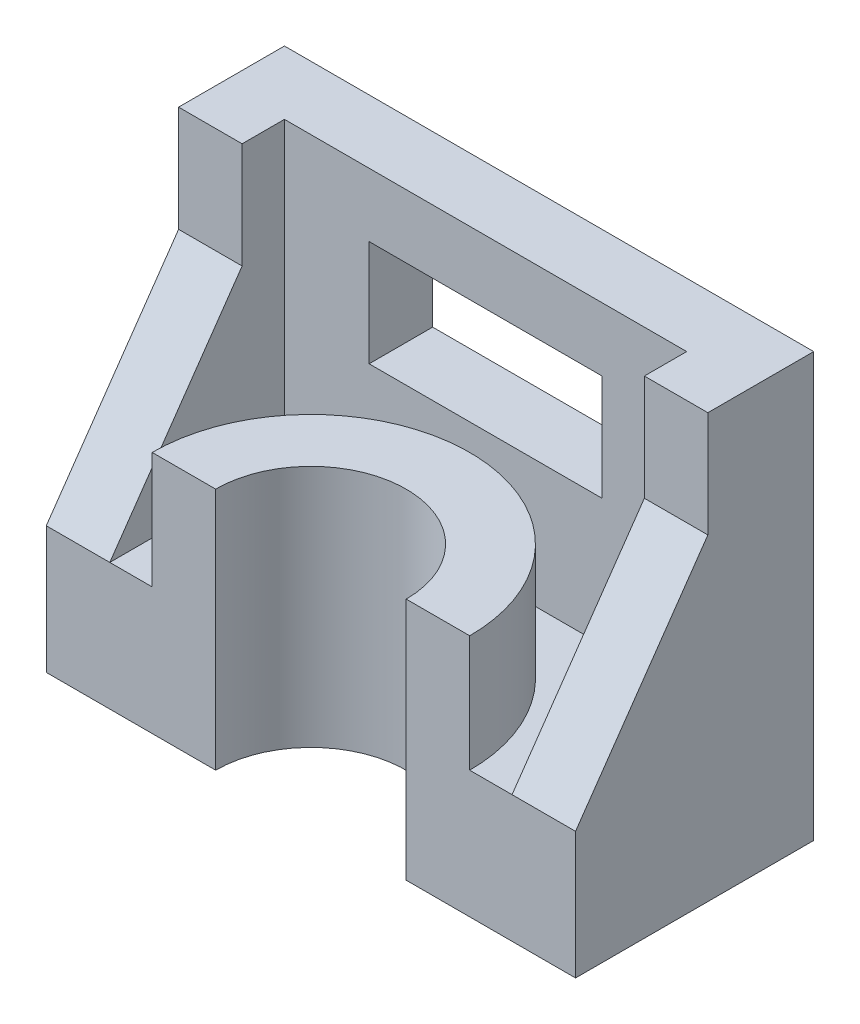
ISO-10303-21;
HEADER;
FILE_DESCRIPTION(('STEP AP214'),'2;1');
FILE_NAME('part.step','',(''),(''),'','','');
FILE_SCHEMA(('AUTOMOTIVE_DESIGN { 1 0 10303 214 1 1 1 1 }'));
ENDSEC;
DATA;
#1=APPLICATION_CONTEXT('core data for automotive mechanical design processes');
#2=APPLICATION_PROTOCOL_DEFINITION('international standard','automotive_design',2000,#1);
#3=PRODUCT_CONTEXT('',#1,'mechanical');
#4=PRODUCT('Part','Part','',(#3));
#5=PRODUCT_RELATED_PRODUCT_CATEGORY('part','',(#4));
#6=PRODUCT_DEFINITION_FORMATION('','',#4);
#7=PRODUCT_DEFINITION_CONTEXT('part definition',#1,'design');
#8=PRODUCT_DEFINITION('design','',#6,#7);
#9=PRODUCT_DEFINITION_SHAPE('','',#8);
#10=(LENGTH_UNIT() NAMED_UNIT(*) SI_UNIT(.MILLI.,.METRE.));
#11=(NAMED_UNIT(*) PLANE_ANGLE_UNIT() SI_UNIT($,.RADIAN.));
#12=(NAMED_UNIT(*) SI_UNIT($,.STERADIAN.) SOLID_ANGLE_UNIT());
#13=UNCERTAINTY_MEASURE_WITH_UNIT(LENGTH_MEASURE(1.E-05),#10,'distance_accuracy_value','');
#14=(GEOMETRIC_REPRESENTATION_CONTEXT(3) GLOBAL_UNCERTAINTY_ASSIGNED_CONTEXT((#13)) GLOBAL_UNIT_ASSIGNED_CONTEXT((#10,
#11,#12)) REPRESENTATION_CONTEXT('',''));
#15=CARTESIAN_POINT('',(0.,0.,0.));
#16=DIRECTION('',(0.,0.,1.));
#17=DIRECTION('',(1.,0.,0.));
#18=AXIS2_PLACEMENT_3D('',#15,#16,#17);
#19=CARTESIAN_POINT('',(0.,24.,16.3055153558052));
#20=DIRECTION('',(0.,0.,-1.));
#21=DIRECTION('',(-1.,0.,0.));
#22=AXIS2_PLACEMENT_3D('',#19,#20,#21);
#23=PLANE('',#22);
#24=DIRECTION('',(0.,-1.,0.));
#25=VECTOR('',#24,1.);
#26=CARTESIAN_POINT('',(37.7851401123596,60.,16.3055153558052));
#27=LINE('',#26,#25);
#28=CARTESIAN_POINT('',(37.7851401123596,24.,16.3055153558052));
#29=VERTEX_POINT('',#28);
#30=CARTESIAN_POINT('',(37.7851401123596,0.,16.3055153558052));
#31=VERTEX_POINT('',#30);
#32=EDGE_CURVE('E338',#29,#31,#27,.T.);
#33=ORIENTED_EDGE('',*,*,#32,.F.);
#34=DIRECTION('',(-1.,0.,0.));
#35=VECTOR('',#34,1.);
#36=CARTESIAN_POINT('',(41.7851401123596,24.,16.3055153558052));
#37=LINE('',#36,#35);
#38=CARTESIAN_POINT('',(25.7851401123595,24.,16.3055153558052));
#39=VERTEX_POINT('',#38);
#40=EDGE_CURVE('E257',#29,#39,#37,.T.);
#41=ORIENTED_EDGE('',*,*,#40,.T.);
#42=DIRECTION('',(1.,0.,0.));
#43=VECTOR('',#42,1.);
#44=CARTESIAN_POINT('',(0.,24.,16.3055153558052));
#45=LINE('',#44,#43);
#46=CARTESIAN_POINT('',(17.7851401123596,24.,16.3055153558052));
#47=VERTEX_POINT('',#46);
#48=EDGE_CURVE('E358',#47,#39,#45,.T.);
#49=ORIENTED_EDGE('',*,*,#48,.F.);
#50=DIRECTION('',(0.,-1.,0.));
#51=VECTOR('',#50,1.);
#52=CARTESIAN_POINT('',(17.7851401123596,46.,16.3055153558052));
#53=LINE('',#52,#51);
#54=CARTESIAN_POINT('',(17.7851401123596,46.,16.3055153558052));
#55=VERTEX_POINT('',#54);
#56=EDGE_CURVE('E243',#55,#47,#53,.T.);
#57=ORIENTED_EDGE('',*,*,#56,.F.);
#58=DIRECTION('',(1.,0.,0.));
#59=VECTOR('',#58,1.);
#60=CARTESIAN_POINT('',(0.,46.,16.3055153558052));
#61=LINE('',#60,#59);
#62=CARTESIAN_POINT('',(5.78514011235955,46.,16.3055153558052));
#63=VERTEX_POINT('',#62);
#64=EDGE_CURVE('E223',#63,#55,#61,.T.);
#65=ORIENTED_EDGE('',*,*,#64,.F.);
#66=DIRECTION('',(0.,-1.,0.));
#67=VECTOR('',#66,1.);
#68=CARTESIAN_POINT('',(5.78514011235955,46.,16.3055153558052));
#69=LINE('',#68,#67);
#70=CARTESIAN_POINT('',(5.78514011235955,0.,16.3055153558052));
#71=VERTEX_POINT('',#70);
#72=EDGE_CURVE('E246',#63,#71,#69,.T.);
#73=ORIENTED_EDGE('',*,*,#72,.T.);
#74=DIRECTION('',(1.,0.,0.));
#75=VECTOR('',#74,1.);
#76=CARTESIAN_POINT('',(0.,0.,16.3055153558052));
#77=LINE('',#76,#75);
#78=EDGE_CURVE('E354',#71,#31,#77,.T.);
#79=ORIENTED_EDGE('',*,*,#78,.T.);
#80=EDGE_LOOP('',(#33,#41,#49,#57,#65,#73,#79));
#81=FACE_BOUND('',#80,.T.);
#82=ADVANCED_FACE('F39',(#81),#23,.F.);
#83=CARTESIAN_POINT('',(0.,24.,16.3055153558052));
#84=DIRECTION('',(0.,0.,-1.));
#85=DIRECTION('',(-1.,0.,0.));
#86=AXIS2_PLACEMENT_3D('',#83,#84,#85);
#87=PLANE('',#86);
#88=DIRECTION('',(1.,0.,0.));
#89=VECTOR('',#88,1.);
#90=CARTESIAN_POINT('',(0.,24.,16.3055153558052));
#91=LINE('',#90,#89);
#92=CARTESIAN_POINT('',(-50.2148598876405,24.,16.3055153558052));
#93=VERTEX_POINT('',#92);
#94=CARTESIAN_POINT('',(-42.2148598876404,24.,16.3055153558052));
#95=VERTEX_POINT('',#94);
#96=EDGE_CURVE('E11',#93,#95,#91,.T.);
#97=ORIENTED_EDGE('',*,*,#96,.F.);
#98=CARTESIAN_POINT('',(-62.2148598876404,24.,16.3055153558052));
#99=VERTEX_POINT('',#98);
#100=EDGE_CURVE('E253',#93,#99,#37,.T.);
#101=ORIENTED_EDGE('',*,*,#100,.T.);
#102=DIRECTION('',(0.,-1.,0.));
#103=VECTOR('',#102,1.);
#104=CARTESIAN_POINT('',(-62.2148598876404,60.,16.3055153558052));
#105=LINE('',#104,#103);
#106=CARTESIAN_POINT('',(-62.2148598876404,0.,16.3055153558052));
#107=VERTEX_POINT('',#106);
#108=EDGE_CURVE('E348',#99,#107,#105,.T.);
#109=ORIENTED_EDGE('',*,*,#108,.T.);
#110=DIRECTION('',(1.,0.,0.));
#111=VECTOR('',#110,1.);
#112=CARTESIAN_POINT('',(0.,0.,16.3055153558052));
#113=LINE('',#112,#111);
#114=CARTESIAN_POINT('',(-30.2148598876404,0.,16.3055153558052));
#115=VERTEX_POINT('',#114);
#116=EDGE_CURVE('E42',#107,#115,#113,.T.);
#117=ORIENTED_EDGE('',*,*,#116,.T.);
#118=DIRECTION('',(0.,-1.,0.));
#119=VECTOR('',#118,1.);
#120=CARTESIAN_POINT('',(-30.2148598876404,46.,16.3055153558052));
#121=LINE('',#120,#119);
#122=CARTESIAN_POINT('',(-30.2148598876404,46.,16.3055153558052));
#123=VERTEX_POINT('',#122);
#124=EDGE_CURVE('E232',#123,#115,#121,.T.);
#125=ORIENTED_EDGE('',*,*,#124,.F.);
#126=DIRECTION('',(1.,0.,0.));
#127=VECTOR('',#126,1.);
#128=CARTESIAN_POINT('',(0.,46.,16.3055153558052));
#129=LINE('',#128,#127);
#130=CARTESIAN_POINT('',(-42.2148598876404,46.,16.3055153558052));
#131=VERTEX_POINT('',#130);
#132=EDGE_CURVE('E229',#131,#123,#129,.T.);
#133=ORIENTED_EDGE('',*,*,#132,.F.);
#134=DIRECTION('',(0.,-1.,0.));
#135=VECTOR('',#134,1.);
#136=CARTESIAN_POINT('',(-42.2148598876404,46.,16.3055153558052));
#137=LINE('',#136,#135);
#138=EDGE_CURVE('E239',#131,#95,#137,.T.);
#139=ORIENTED_EDGE('',*,*,#138,.T.);
#140=EDGE_LOOP('',(#97,#101,#109,#117,#125,#133,#139));
#141=FACE_BOUND('',#140,.T.);
#142=ADVANCED_FACE('F380',(#141),#87,.F.);
#143=CARTESIAN_POINT('',(0.,24.,0.));
#144=DIRECTION('',(0.,1.,0.));
#145=DIRECTION('',(0.,0.,1.));
#146=AXIS2_PLACEMENT_3D('',#143,#144,#145);
#147=PLANE('',#146);
#148=CARTESIAN_POINT('',(-12.2148598876404,24.,16.3055153558052));
#149=DIRECTION('',(0.,1.,0.));
#150=DIRECTION('',(0.,0.,1.));
#151=AXIS2_PLACEMENT_3D('',#148,#149,#150);
#152=CIRCLE('',#151,30.);
#153=EDGE_CURVE('E355',#47,#95,#152,.T.);
#154=ORIENTED_EDGE('',*,*,#153,.F.);
#155=ORIENTED_EDGE('',*,*,#48,.T.);
#156=DIRECTION('',(0.,0.,1.));
#157=VECTOR('',#156,1.);
#158=CARTESIAN_POINT('',(25.7851401123595,24.,0.));
#159=LINE('',#158,#157);
#160=CARTESIAN_POINT('',(25.7851401123595,24.,-16.6944846441948));
#161=VERTEX_POINT('',#160);
#162=EDGE_CURVE('E362',#161,#39,#159,.T.);
#163=ORIENTED_EDGE('',*,*,#162,.F.);
#164=DIRECTION('',(1.,0.,0.));
#165=VECTOR('',#164,1.);
#166=CARTESIAN_POINT('',(0.,24.,-16.6944846441948));
#167=LINE('',#166,#165);
#168=CARTESIAN_POINT('',(-50.2148598876405,24.,-16.6944846441948));
#169=VERTEX_POINT('',#168);
#170=EDGE_CURVE('E366',#169,#161,#167,.T.);
#171=ORIENTED_EDGE('',*,*,#170,.F.);
#172=DIRECTION('',(0.,0.,-1.));
#173=VECTOR('',#172,1.);
#174=CARTESIAN_POINT('',(-50.2148598876405,24.,0.));
#175=LINE('',#174,#173);
#176=EDGE_CURVE('E48',#93,#169,#175,.T.);
#177=ORIENTED_EDGE('',*,*,#176,.F.);
#178=ORIENTED_EDGE('',*,*,#96,.T.);
#179=EDGE_LOOP('',(#154,#155,#163,#171,#177,#178));
#180=FACE_BOUND('',#179,.T.);
#181=ADVANCED_FACE('F400',(#180),#147,.T.);
#182=CARTESIAN_POINT('',(0.,0.,0.));
#183=DIRECTION('',(0.,1.,0.));
#184=DIRECTION('',(0.,0.,1.));
#185=AXIS2_PLACEMENT_3D('',#182,#183,#184);
#186=PLANE('',#185);
#187=DIRECTION('',(0.,0.,1.));
#188=VECTOR('',#187,1.);
#189=CARTESIAN_POINT('',(-62.2148598876404,0.,0.));
#190=LINE('',#189,#188);
#191=CARTESIAN_POINT('',(-62.2148598876404,0.,-28.6944846441948));
#192=VERTEX_POINT('',#191);
#193=EDGE_CURVE('E344',#192,#107,#190,.T.);
#194=ORIENTED_EDGE('',*,*,#193,.F.);
#195=DIRECTION('',(1.,0.,0.));
#196=VECTOR('',#195,1.);
#197=CARTESIAN_POINT('',(0.,0.,-28.6944846441948));
#198=LINE('',#197,#196);
#199=CARTESIAN_POINT('',(37.7851401123596,0.,-28.6944846441948));
#200=VERTEX_POINT('',#199);
#201=EDGE_CURVE('E269',#192,#200,#198,.T.);
#202=ORIENTED_EDGE('',*,*,#201,.T.);
#203=DIRECTION('',(0.,0.,1.));
#204=VECTOR('',#203,1.);
#205=CARTESIAN_POINT('',(37.7851401123596,0.,0.));
#206=LINE('',#205,#204);
#207=EDGE_CURVE('E333',#200,#31,#206,.T.);
#208=ORIENTED_EDGE('',*,*,#207,.T.);
#209=ORIENTED_EDGE('',*,*,#78,.F.);
#210=CARTESIAN_POINT('',(-12.2148598876404,0.,16.3055153558052));
#211=DIRECTION('',(0.,1.,0.));
#212=DIRECTION('',(0.,0.,1.));
#213=AXIS2_PLACEMENT_3D('',#210,#211,#212);
#214=CIRCLE('',#213,18.);
#215=EDGE_CURVE('E218',#71,#115,#214,.T.);
#216=ORIENTED_EDGE('',*,*,#215,.T.);
#217=ORIENTED_EDGE('',*,*,#116,.F.);
#218=EDGE_LOOP('',(#194,#202,#208,#209,#216,#217));
#219=FACE_BOUND('',#218,.T.);
#220=ADVANCED_FACE('F388',(#219),#186,.F.);
#221=CARTESIAN_POINT('',(-50.2148598876405,60.,0.));
#222=DIRECTION('',(-1.,0.,0.));
#223=DIRECTION('',(0.,0.,1.));
#224=AXIS2_PLACEMENT_3D('',#221,#222,#223);
#225=PLANE('',#224);
#226=DIRECTION('',(0.,-1.,0.));
#227=VECTOR('',#226,1.);
#228=CARTESIAN_POINT('',(-50.2148598876405,80.,-8.69448464419478));
#229=LINE('',#228,#227);
#230=CARTESIAN_POINT('',(-50.2148598876405,80.,-8.69448464419478));
#231=VERTEX_POINT('',#230);
#232=CARTESIAN_POINT('',(-50.2148598876405,60.,-8.69448464419478));
#233=VERTEX_POINT('',#232);
#234=EDGE_CURVE('E309',#231,#233,#229,.T.);
#235=ORIENTED_EDGE('',*,*,#234,.T.);
#236=DIRECTION('',(0.,-0.821369965673296,0.570395809495344));
#237=VECTOR('',#236,1.);
#238=CARTESIAN_POINT('',(-50.2148598876405,55.9265818949634,-5.8657220712527));
#239=LINE('',#238,#237);
#240=EDGE_CURVE('E265',#233,#93,#239,.T.);
#241=ORIENTED_EDGE('',*,*,#240,.T.);
#242=ORIENTED_EDGE('',*,*,#176,.T.);
#243=DIRECTION('',(0.,-1.,0.));
#244=VECTOR('',#243,1.);
#245=CARTESIAN_POINT('',(-50.2148598876405,80.,-16.6944846441948));
#246=LINE('',#245,#244);
#247=CARTESIAN_POINT('',(-50.2148598876405,80.,-16.6944846441948));
#248=VERTEX_POINT('',#247);
#249=EDGE_CURVE('E305',#248,#169,#246,.T.);
#250=ORIENTED_EDGE('',*,*,#249,.F.);
#251=DIRECTION('',(0.,0.,-1.));
#252=VECTOR('',#251,1.);
#253=CARTESIAN_POINT('',(-50.2148598876405,80.,0.));
#254=LINE('',#253,#252);
#255=EDGE_CURVE('E292',#231,#248,#254,.T.);
#256=ORIENTED_EDGE('',*,*,#255,.F.);
#257=EDGE_LOOP('',(#235,#241,#242,#250,#256));
#258=FACE_BOUND('',#257,.T.);
#259=ADVANCED_FACE('F404',(#258),#225,.F.);
#260=CARTESIAN_POINT('',(-62.2148598876404,60.,0.));
#261=DIRECTION('',(1.,0.,0.));
#262=DIRECTION('',(0.,0.,-1.));
#263=AXIS2_PLACEMENT_3D('',#260,#261,#262);
#264=PLANE('',#263);
#265=ORIENTED_EDGE('',*,*,#108,.F.);
#266=DIRECTION('',(0.,-0.821369965673296,0.570395809495344));
#267=VECTOR('',#266,1.);
#268=CARTESIAN_POINT('',(-62.2148598876404,24.,16.3055153558052));
#269=LINE('',#268,#267);
#270=CARTESIAN_POINT('',(-62.2148598876404,60.,-8.69448464419478));
#271=VERTEX_POINT('',#270);
#272=EDGE_CURVE('E250',#271,#99,#269,.T.);
#273=ORIENTED_EDGE('',*,*,#272,.F.);
#274=DIRECTION('',(0.,-1.,0.));
#275=VECTOR('',#274,1.);
#276=CARTESIAN_POINT('',(-62.2148598876404,80.,-8.69448464419478));
#277=LINE('',#276,#275);
#278=CARTESIAN_POINT('',(-62.2148598876404,80.,-8.69448464419478));
#279=VERTEX_POINT('',#278);
#280=EDGE_CURVE('E313',#279,#271,#277,.T.);
#281=ORIENTED_EDGE('',*,*,#280,.F.);
#282=DIRECTION('',(0.,0.,1.));
#283=VECTOR('',#282,1.);
#284=CARTESIAN_POINT('',(-62.2148598876404,80.,0.));
#285=LINE('',#284,#283);
#286=CARTESIAN_POINT('',(-62.2148598876404,80.,-28.6944846441948));
#287=VERTEX_POINT('',#286);
#288=EDGE_CURVE('E285',#287,#279,#285,.T.);
#289=ORIENTED_EDGE('',*,*,#288,.F.);
#290=DIRECTION('',(0.,-1.,0.));
#291=VECTOR('',#290,1.);
#292=CARTESIAN_POINT('',(-62.2148598876404,80.,-28.6944846441948));
#293=LINE('',#292,#291);
#294=EDGE_CURVE('E317',#287,#192,#293,.T.);
#295=ORIENTED_EDGE('',*,*,#294,.T.);
#296=ORIENTED_EDGE('',*,*,#193,.T.);
#297=EDGE_LOOP('',(#265,#273,#281,#289,#295,#296));
#298=FACE_BOUND('',#297,.T.);
#299=ADVANCED_FACE('F417',(#298),#264,.F.);
#300=CARTESIAN_POINT('',(25.7851401123595,60.,0.));
#301=DIRECTION('',(1.,0.,0.));
#302=DIRECTION('',(0.,0.,-1.));
#303=AXIS2_PLACEMENT_3D('',#300,#301,#302);
#304=PLANE('',#303);
#305=ORIENTED_EDGE('',*,*,#162,.T.);
#306=DIRECTION('',(0.,0.821369965673296,-0.570395809495344));
#307=VECTOR('',#306,1.);
#308=CARTESIAN_POINT('',(25.7851401123595,55.9265818949634,-5.8657220712527));
#309=LINE('',#308,#307);
#310=CARTESIAN_POINT('',(25.7851401123595,60.,-8.69448464419478));
#311=VERTEX_POINT('',#310);
#312=EDGE_CURVE('E261',#39,#311,#309,.T.);
#313=ORIENTED_EDGE('',*,*,#312,.T.);
#314=DIRECTION('',(0.,-1.,0.));
#315=VECTOR('',#314,1.);
#316=CARTESIAN_POINT('',(25.7851401123595,80.,-8.69448464419478));
#317=LINE('',#316,#315);
#318=CARTESIAN_POINT('',(25.7851401123595,80.,-8.69448464419478));
#319=VERTEX_POINT('',#318);
#320=EDGE_CURVE('E329',#319,#311,#317,.T.);
#321=ORIENTED_EDGE('',*,*,#320,.F.);
#322=DIRECTION('',(0.,0.,1.));
#323=VECTOR('',#322,1.);
#324=CARTESIAN_POINT('',(25.7851401123595,80.,0.));
#325=LINE('',#324,#323);
#326=CARTESIAN_POINT('',(25.7851401123595,80.,-16.6944846441948));
#327=VERTEX_POINT('',#326);
#328=EDGE_CURVE('E270',#327,#319,#325,.T.);
#329=ORIENTED_EDGE('',*,*,#328,.F.);
#330=DIRECTION('',(0.,-1.,0.));
#331=VECTOR('',#330,1.);
#332=CARTESIAN_POINT('',(25.7851401123595,80.,-16.6944846441948));
#333=LINE('',#332,#331);
#334=EDGE_CURVE('E298',#327,#161,#333,.T.);
#335=ORIENTED_EDGE('',*,*,#334,.T.);
#336=EDGE_LOOP('',(#305,#313,#321,#329,#335));
#337=FACE_BOUND('',#336,.T.);
#338=ADVANCED_FACE('F437',(#337),#304,.F.);
#339=CARTESIAN_POINT('',(37.7851401123596,60.,0.));
#340=DIRECTION('',(1.,0.,0.));
#341=DIRECTION('',(0.,0.,-1.));
#342=AXIS2_PLACEMENT_3D('',#339,#340,#341);
#343=PLANE('',#342);
#344=DIRECTION('',(0.,0.821369965673296,-0.570395809495344));
#345=VECTOR('',#344,1.);
#346=CARTESIAN_POINT('',(37.7851401123596,55.9265818949634,-5.8657220712527));
#347=LINE('',#346,#345);
#348=CARTESIAN_POINT('',(37.7851401123596,60.,-8.69448464419478));
#349=VERTEX_POINT('',#348);
#350=EDGE_CURVE('E258',#29,#349,#347,.T.);
#351=ORIENTED_EDGE('',*,*,#350,.F.);
#352=ORIENTED_EDGE('',*,*,#32,.T.);
#353=ORIENTED_EDGE('',*,*,#207,.F.);
#354=DIRECTION('',(0.,-1.,0.));
#355=VECTOR('',#354,1.);
#356=CARTESIAN_POINT('',(37.7851401123596,80.,-28.6944846441948));
#357=LINE('',#356,#355);
#358=CARTESIAN_POINT('',(37.7851401123596,80.,-28.6944846441948));
#359=VERTEX_POINT('',#358);
#360=EDGE_CURVE('E321',#359,#200,#357,.T.);
#361=ORIENTED_EDGE('',*,*,#360,.F.);
#362=DIRECTION('',(0.,0.,1.));
#363=VECTOR('',#362,1.);
#364=CARTESIAN_POINT('',(37.7851401123596,80.,0.));
#365=LINE('',#364,#363);
#366=CARTESIAN_POINT('',(37.7851401123596,80.,-8.69448464419478));
#367=VERTEX_POINT('',#366);
#368=EDGE_CURVE('E277',#359,#367,#365,.T.);
#369=ORIENTED_EDGE('',*,*,#368,.T.);
#370=DIRECTION('',(0.,-1.,0.));
#371=VECTOR('',#370,1.);
#372=CARTESIAN_POINT('',(37.7851401123596,80.,-8.69448464419478));
#373=LINE('',#372,#371);
#374=EDGE_CURVE('E325',#367,#349,#373,.T.);
#375=ORIENTED_EDGE('',*,*,#374,.T.);
#376=EDGE_LOOP('',(#351,#352,#353,#361,#369,#375));
#377=FACE_BOUND('',#376,.T.);
#378=ADVANCED_FACE('F425',(#377),#343,.T.);
#379=CARTESIAN_POINT('',(0.,80.,-8.69448464419477));
#380=DIRECTION('',(0.,0.,-1.));
#381=DIRECTION('',(-1.,0.,0.));
#382=AXIS2_PLACEMENT_3D('',#379,#380,#381);
#383=PLANE('',#382);
#384=DIRECTION('',(1.,0.,0.));
#385=VECTOR('',#384,1.);
#386=CARTESIAN_POINT('',(0.,60.,-8.69448464419477));
#387=LINE('',#386,#385);
#388=EDGE_CURVE('E334',#311,#349,#387,.T.);
#389=ORIENTED_EDGE('',*,*,#388,.T.);
#390=ORIENTED_EDGE('',*,*,#374,.F.);
#391=DIRECTION('',(1.,0.,0.));
#392=VECTOR('',#391,1.);
#393=CARTESIAN_POINT('',(0.,80.,-8.69448464419477));
#394=LINE('',#393,#392);
#395=EDGE_CURVE('E274',#319,#367,#394,.T.);
#396=ORIENTED_EDGE('',*,*,#395,.F.);
#397=ORIENTED_EDGE('',*,*,#320,.T.);
#398=EDGE_LOOP('',(#389,#390,#396,#397));
#399=FACE_BOUND('',#398,.T.);
#400=ADVANCED_FACE('F432',(#399),#383,.F.);
#401=CARTESIAN_POINT('',(0.,80.,-28.6944846441948));
#402=DIRECTION('',(0.,0.,-1.));
#403=DIRECTION('',(-1.,0.,0.));
#404=AXIS2_PLACEMENT_3D('',#401,#402,#403);
#405=PLANE('',#404);
#406=DIRECTION('',(0.,1.,0.));
#407=VECTOR('',#406,1.);
#408=CARTESIAN_POINT('',(-34.2148598876405,80.,-28.6944846441948));
#409=LINE('',#408,#407);
#410=CARTESIAN_POINT('',(-34.2148598876404,48.,-28.6944846441948));
#411=VERTEX_POINT('',#410);
#412=CARTESIAN_POINT('',(-34.2148598876405,68.,-28.6944846441948));
#413=VERTEX_POINT('',#412);
#414=EDGE_CURVE('E215',#411,#413,#409,.T.);
#415=ORIENTED_EDGE('',*,*,#414,.F.);
#416=DIRECTION('',(-1.,0.,0.));
#417=VECTOR('',#416,1.);
#418=CARTESIAN_POINT('',(0.,48.,-28.6944846441948));
#419=LINE('',#418,#417);
#420=CARTESIAN_POINT('',(9.78514011235956,48.,-28.6944846441948));
#421=VERTEX_POINT('',#420);
#422=EDGE_CURVE('E203',#421,#411,#419,.T.);
#423=ORIENTED_EDGE('',*,*,#422,.F.);
#424=DIRECTION('',(0.,-1.,0.));
#425=VECTOR('',#424,1.);
#426=CARTESIAN_POINT('',(9.78514011235955,80.,-28.6944846441948));
#427=LINE('',#426,#425);
#428=CARTESIAN_POINT('',(9.78514011235955,68.,-28.6944846441948));
#429=VERTEX_POINT('',#428);
#430=EDGE_CURVE('E178',#429,#421,#427,.T.);
#431=ORIENTED_EDGE('',*,*,#430,.F.);
#432=DIRECTION('',(1.,0.,0.));
#433=VECTOR('',#432,1.);
#434=CARTESIAN_POINT('',(0.,68.,-28.6944846441948));
#435=LINE('',#434,#433);
#436=EDGE_CURVE('E212',#413,#429,#435,.T.);
#437=ORIENTED_EDGE('',*,*,#436,.F.);
#438=EDGE_LOOP('',(#415,#423,#431,#437));
#439=FACE_BOUND('',#438,.T.);
#440=ORIENTED_EDGE('',*,*,#201,.F.);
#441=ORIENTED_EDGE('',*,*,#294,.F.);
#442=DIRECTION('',(1.,0.,0.));
#443=VECTOR('',#442,1.);
#444=CARTESIAN_POINT('',(0.,80.,-28.6944846441948));
#445=LINE('',#444,#443);
#446=EDGE_CURVE('E281',#287,#359,#445,.T.);
#447=ORIENTED_EDGE('',*,*,#446,.T.);
#448=ORIENTED_EDGE('',*,*,#360,.T.);
#449=EDGE_LOOP('',(#440,#441,#447,#448));
#450=FACE_BOUND('',#449,.T.);
#451=ADVANCED_FACE('F421',(#439,#450),#405,.T.);
#452=CARTESIAN_POINT('',(0.,80.,-8.69448464419476));
#453=DIRECTION('',(0.,0.,1.));
#454=DIRECTION('',(1.,0.,0.));
#455=AXIS2_PLACEMENT_3D('',#452,#453,#454);
#456=PLANE('',#455);
#457=ORIENTED_EDGE('',*,*,#280,.T.);
#458=DIRECTION('',(-1.,0.,0.));
#459=VECTOR('',#458,1.);
#460=CARTESIAN_POINT('',(0.,60.,-8.69448464419476));
#461=LINE('',#460,#459);
#462=EDGE_CURVE('E345',#233,#271,#461,.T.);
#463=ORIENTED_EDGE('',*,*,#462,.F.);
#464=ORIENTED_EDGE('',*,*,#234,.F.);
#465=DIRECTION('',(-1.,0.,0.));
#466=VECTOR('',#465,1.);
#467=CARTESIAN_POINT('',(0.,80.,-8.69448464419476));
#468=LINE('',#467,#466);
#469=EDGE_CURVE('E288',#231,#279,#468,.T.);
#470=ORIENTED_EDGE('',*,*,#469,.T.);
#471=EDGE_LOOP('',(#457,#463,#464,#470));
#472=FACE_BOUND('',#471,.T.);
#473=ADVANCED_FACE('F412',(#472),#456,.T.);
#474=CARTESIAN_POINT('',(0.,80.,-16.6944846441948));
#475=DIRECTION('',(0.,0.,-1.));
#476=DIRECTION('',(-1.,0.,0.));
#477=AXIS2_PLACEMENT_3D('',#474,#475,#476);
#478=PLANE('',#477);
#479=DIRECTION('',(1.,0.,0.));
#480=VECTOR('',#479,1.);
#481=CARTESIAN_POINT('',(-34.2148598876404,48.,-16.6944846441948));
#482=LINE('',#481,#480);
#483=CARTESIAN_POINT('',(-34.2148598876404,48.,-16.6944846441948));
#484=VERTEX_POINT('',#483);
#485=CARTESIAN_POINT('',(9.78514011235956,48.,-16.6944846441948));
#486=VERTEX_POINT('',#485);
#487=EDGE_CURVE('E185',#484,#486,#482,.T.);
#488=ORIENTED_EDGE('',*,*,#487,.F.);
#489=DIRECTION('',(0.,-1.,0.));
#490=VECTOR('',#489,1.);
#491=CARTESIAN_POINT('',(-34.2148598876405,68.,-16.6944846441948));
#492=LINE('',#491,#490);
#493=CARTESIAN_POINT('',(-34.2148598876405,68.,-16.6944846441948));
#494=VERTEX_POINT('',#493);
#495=EDGE_CURVE('E64',#494,#484,#492,.T.);
#496=ORIENTED_EDGE('',*,*,#495,.F.);
#497=DIRECTION('',(-1.,0.,0.));
#498=VECTOR('',#497,1.);
#499=CARTESIAN_POINT('',(-34.2148598876405,68.,-16.6944846441948));
#500=LINE('',#499,#498);
#501=CARTESIAN_POINT('',(9.78514011235955,68.,-16.6944846441948));
#502=VERTEX_POINT('',#501);
#503=EDGE_CURVE('E193',#502,#494,#500,.T.);
#504=ORIENTED_EDGE('',*,*,#503,.F.);
#505=DIRECTION('',(0.,1.,0.));
#506=VECTOR('',#505,1.);
#507=CARTESIAN_POINT('',(9.78514011235955,68.,-16.6944846441948));
#508=LINE('',#507,#506);
#509=EDGE_CURVE('E175',#486,#502,#508,.T.);
#510=ORIENTED_EDGE('',*,*,#509,.F.);
#511=EDGE_LOOP('',(#488,#496,#504,#510));
#512=FACE_BOUND('',#511,.T.);
#513=ORIENTED_EDGE('',*,*,#170,.T.);
#514=ORIENTED_EDGE('',*,*,#334,.F.);
#515=DIRECTION('',(1.,0.,0.));
#516=VECTOR('',#515,1.);
#517=CARTESIAN_POINT('',(0.,80.,-16.6944846441948));
#518=LINE('',#517,#516);
#519=EDGE_CURVE('E295',#248,#327,#518,.T.);
#520=ORIENTED_EDGE('',*,*,#519,.F.);
#521=ORIENTED_EDGE('',*,*,#249,.T.);
#522=EDGE_LOOP('',(#513,#514,#520,#521));
#523=FACE_BOUND('',#522,.T.);
#524=ADVANCED_FACE('F190',(#512,#523),#478,.F.);
#525=CARTESIAN_POINT('',(0.,80.,0.));
#526=DIRECTION('',(0.,1.,0.));
#527=DIRECTION('',(0.,0.,1.));
#528=AXIS2_PLACEMENT_3D('',#525,#526,#527);
#529=PLANE('',#528);
#530=ORIENTED_EDGE('',*,*,#328,.T.);
#531=ORIENTED_EDGE('',*,*,#395,.T.);
#532=ORIENTED_EDGE('',*,*,#368,.F.);
#533=ORIENTED_EDGE('',*,*,#446,.F.);
#534=ORIENTED_EDGE('',*,*,#288,.T.);
#535=ORIENTED_EDGE('',*,*,#469,.F.);
#536=ORIENTED_EDGE('',*,*,#255,.T.);
#537=ORIENTED_EDGE('',*,*,#519,.T.);
#538=EDGE_LOOP('',(#530,#531,#532,#533,#534,#535,#536,#537));
#539=FACE_BOUND('',#538,.T.);
#540=ADVANCED_FACE('F427',(#539),#529,.T.);
#541=CARTESIAN_POINT('',(41.7851401123596,24.,16.3055153558052));
#542=DIRECTION('',(0.,-0.570395809495344,-0.821369965673296));
#543=DIRECTION('',(0.,0.821369965673296,-0.570395809495344));
#544=AXIS2_PLACEMENT_3D('',#541,#542,#543);
#545=PLANE('',#544);
#546=ORIENTED_EDGE('',*,*,#462,.T.);
#547=ORIENTED_EDGE('',*,*,#272,.T.);
#548=ORIENTED_EDGE('',*,*,#100,.F.);
#549=ORIENTED_EDGE('',*,*,#240,.F.);
#550=EDGE_LOOP('',(#546,#547,#548,#549));
#551=FACE_BOUND('',#550,.T.);
#552=ADVANCED_FACE('F409',(#551),#545,.F.);
#553=ORIENTED_EDGE('',*,*,#40,.F.);
#554=ORIENTED_EDGE('',*,*,#350,.T.);
#555=ORIENTED_EDGE('',*,*,#388,.F.);
#556=ORIENTED_EDGE('',*,*,#312,.F.);
#557=EDGE_LOOP('',(#553,#554,#555,#556));
#558=FACE_BOUND('',#557,.T.);
#559=ADVANCED_FACE('F497',(#558),#545,.F.);
#560=CARTESIAN_POINT('',(-12.2148598876404,46.,16.3055153558052));
#561=DIRECTION('',(0.,-1.,0.));
#562=DIRECTION('',(0.,0.,-1.));
#563=AXIS2_PLACEMENT_3D('',#560,#561,#562);
#564=CYLINDRICAL_SURFACE('',#563,18.);
#565=ORIENTED_EDGE('',*,*,#215,.F.);
#566=ORIENTED_EDGE('',*,*,#72,.F.);
#567=CARTESIAN_POINT('',(-12.2148598876404,46.,16.3055153558052));
#568=DIRECTION('',(0.,1.,0.));
#569=DIRECTION('',(0.,0.,1.));
#570=AXIS2_PLACEMENT_3D('',#567,#568,#569);
#571=CIRCLE('',#570,18.);
#572=EDGE_CURVE('E219',#63,#123,#571,.T.);
#573=ORIENTED_EDGE('',*,*,#572,.T.);
#574=ORIENTED_EDGE('',*,*,#124,.T.);
#575=EDGE_LOOP('',(#565,#566,#573,#574));
#576=FACE_BOUND('',#575,.T.);
#577=ADVANCED_FACE('F386',(#576),#564,.F.);
#578=CARTESIAN_POINT('',(-12.2148598876404,46.,16.3055153558052));
#579=DIRECTION('',(0.,-1.,0.));
#580=DIRECTION('',(0.,0.,-1.));
#581=AXIS2_PLACEMENT_3D('',#578,#579,#580);
#582=CYLINDRICAL_SURFACE('',#581,30.);
#583=ORIENTED_EDGE('',*,*,#153,.T.);
#584=ORIENTED_EDGE('',*,*,#138,.F.);
#585=CARTESIAN_POINT('',(-12.2148598876404,46.,16.3055153558052));
#586=DIRECTION('',(0.,1.,0.));
#587=DIRECTION('',(0.,0.,1.));
#588=AXIS2_PLACEMENT_3D('',#585,#586,#587);
#589=CIRCLE('',#588,30.);
#590=EDGE_CURVE('E226',#55,#131,#589,.T.);
#591=ORIENTED_EDGE('',*,*,#590,.F.);
#592=ORIENTED_EDGE('',*,*,#56,.T.);
#593=EDGE_LOOP('',(#583,#584,#591,#592));
#594=FACE_BOUND('',#593,.T.);
#595=ADVANCED_FACE('F492',(#594),#582,.T.);
#596=CARTESIAN_POINT('',(0.,46.,0.));
#597=DIRECTION('',(0.,1.,0.));
#598=DIRECTION('',(0.,0.,1.));
#599=AXIS2_PLACEMENT_3D('',#596,#597,#598);
#600=PLANE('',#599);
#601=ORIENTED_EDGE('',*,*,#572,.F.);
#602=ORIENTED_EDGE('',*,*,#64,.T.);
#603=ORIENTED_EDGE('',*,*,#590,.T.);
#604=ORIENTED_EDGE('',*,*,#132,.T.);
#605=EDGE_LOOP('',(#601,#602,#603,#604));
#606=FACE_BOUND('',#605,.T.);
#607=ADVANCED_FACE('F394',(#606),#600,.T.);
#608=CARTESIAN_POINT('',(-34.2148598876405,68.,-62.6944846441948));
#609=DIRECTION('',(-1.,0.,0.));
#610=DIRECTION('',(0.,-1.,0.));
#611=AXIS2_PLACEMENT_3D('',#608,#609,#610);
#612=PLANE('',#611);
#613=ORIENTED_EDGE('',*,*,#414,.T.);
#614=DIRECTION('',(0.,0.,1.));
#615=VECTOR('',#614,1.);
#616=CARTESIAN_POINT('',(-34.2148598876405,68.,-62.6944846441948));
#617=LINE('',#616,#615);
#618=EDGE_CURVE('E200',#413,#494,#617,.T.);
#619=ORIENTED_EDGE('',*,*,#618,.T.);
#620=ORIENTED_EDGE('',*,*,#495,.T.);
#621=DIRECTION('',(0.,0.,1.));
#622=VECTOR('',#621,1.);
#623=CARTESIAN_POINT('',(-34.2148598876404,48.,-62.6944846441948));
#624=LINE('',#623,#622);
#625=EDGE_CURVE('E182',#411,#484,#624,.T.);
#626=ORIENTED_EDGE('',*,*,#625,.F.);
#627=EDGE_LOOP('',(#613,#619,#620,#626));
#628=FACE_BOUND('',#627,.T.);
#629=ADVANCED_FACE('F475',(#628),#612,.F.);
#630=CARTESIAN_POINT('',(-34.2148598876405,68.,-62.6944846441948));
#631=DIRECTION('',(0.,1.,0.));
#632=DIRECTION('',(0.,0.,1.));
#633=AXIS2_PLACEMENT_3D('',#630,#631,#632);
#634=PLANE('',#633);
#635=ORIENTED_EDGE('',*,*,#436,.T.);
#636=DIRECTION('',(0.,0.,1.));
#637=VECTOR('',#636,1.);
#638=CARTESIAN_POINT('',(9.78514011235955,68.,-62.6944846441948));
#639=LINE('',#638,#637);
#640=EDGE_CURVE('E181',#429,#502,#639,.T.);
#641=ORIENTED_EDGE('',*,*,#640,.T.);
#642=ORIENTED_EDGE('',*,*,#503,.T.);
#643=ORIENTED_EDGE('',*,*,#618,.F.);
#644=EDGE_LOOP('',(#635,#641,#642,#643));
#645=FACE_BOUND('',#644,.T.);
#646=ADVANCED_FACE('F477',(#645),#634,.F.);
#647=CARTESIAN_POINT('',(9.78514011235955,68.,-62.6944846441948));
#648=DIRECTION('',(1.,0.,0.));
#649=DIRECTION('',(0.,1.,0.));
#650=AXIS2_PLACEMENT_3D('',#647,#648,#649);
#651=PLANE('',#650);
#652=ORIENTED_EDGE('',*,*,#430,.T.);
#653=DIRECTION('',(0.,0.,1.));
#654=VECTOR('',#653,1.);
#655=CARTESIAN_POINT('',(9.78514011235956,48.,-62.6944846441948));
#656=LINE('',#655,#654);
#657=EDGE_CURVE('E56',#421,#486,#656,.T.);
#658=ORIENTED_EDGE('',*,*,#657,.T.);
#659=ORIENTED_EDGE('',*,*,#509,.T.);
#660=ORIENTED_EDGE('',*,*,#640,.F.);
#661=EDGE_LOOP('',(#652,#658,#659,#660));
#662=FACE_BOUND('',#661,.T.);
#663=ADVANCED_FACE('F172',(#662),#651,.F.);
#664=CARTESIAN_POINT('',(-34.2148598876404,48.,-62.6944846441948));
#665=DIRECTION('',(0.,-1.,0.));
#666=DIRECTION('',(0.,0.,-1.));
#667=AXIS2_PLACEMENT_3D('',#664,#665,#666);
#668=PLANE('',#667);
#669=ORIENTED_EDGE('',*,*,#422,.T.);
#670=ORIENTED_EDGE('',*,*,#625,.T.);
#671=ORIENTED_EDGE('',*,*,#487,.T.);
#672=ORIENTED_EDGE('',*,*,#657,.F.);
#673=EDGE_LOOP('',(#669,#670,#671,#672));
#674=FACE_BOUND('',#673,.T.);
#675=ADVANCED_FACE('F186',(#674),#668,.F.);
#676=CLOSED_SHELL('',(#82,#142,#181,#220,#259,#299,#338,#378,#400,#451,#473,#524,#540,#552,#559,
#577,#595,#607,#629,#646,#663,#675));
#677=MANIFOLD_SOLID_BREP('B2',#676);
#678=ADVANCED_BREP_SHAPE_REPRESENTATION('',(#18,#677),#14);
#679=SHAPE_DEFINITION_REPRESENTATION(#9,#678);
ENDSEC;
END-ISO-10303-21;
